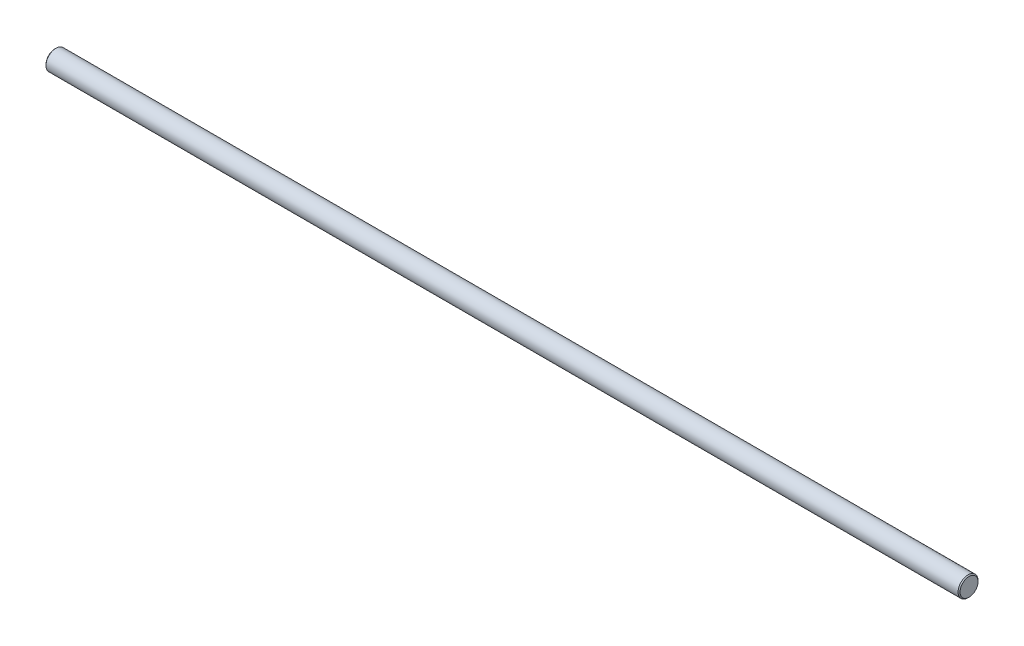
ISO-10303-21;
HEADER;
FILE_DESCRIPTION(('STEP AP214'),'2;1');
FILE_NAME('part.step','',(''),(''),'','','');
FILE_SCHEMA(('AUTOMOTIVE_DESIGN { 1 0 10303 214 1 1 1 1 }'));
ENDSEC;
DATA;
#1=APPLICATION_CONTEXT('core data for automotive mechanical design processes');
#2=APPLICATION_PROTOCOL_DEFINITION('international standard','automotive_design',2000,#1);
#3=PRODUCT_CONTEXT('',#1,'mechanical');
#4=PRODUCT('Part','Part','',(#3));
#5=PRODUCT_RELATED_PRODUCT_CATEGORY('part','',(#4));
#6=PRODUCT_DEFINITION_FORMATION('','',#4);
#7=PRODUCT_DEFINITION_CONTEXT('part definition',#1,'design');
#8=PRODUCT_DEFINITION('design','',#6,#7);
#9=PRODUCT_DEFINITION_SHAPE('','',#8);
#10=(LENGTH_UNIT() NAMED_UNIT(*) SI_UNIT(.MILLI.,.METRE.));
#11=(NAMED_UNIT(*) PLANE_ANGLE_UNIT() SI_UNIT($,.RADIAN.));
#12=(NAMED_UNIT(*) SI_UNIT($,.STERADIAN.) SOLID_ANGLE_UNIT());
#13=UNCERTAINTY_MEASURE_WITH_UNIT(LENGTH_MEASURE(1.E-05),#10,'distance_accuracy_value','');
#14=(GEOMETRIC_REPRESENTATION_CONTEXT(3) GLOBAL_UNCERTAINTY_ASSIGNED_CONTEXT((#13)) GLOBAL_UNIT_ASSIGNED_CONTEXT((#10,
#11,#12)) REPRESENTATION_CONTEXT('',''));
#15=CARTESIAN_POINT('',(0.,0.,0.));
#16=DIRECTION('',(0.,0.,1.));
#17=DIRECTION('',(1.,0.,0.));
#18=AXIS2_PLACEMENT_3D('',#15,#16,#17);
#19=CARTESIAN_POINT('',(0.,0.,0.));
#20=DIRECTION('',(1.,0.,0.));
#21=DIRECTION('',(0.,0.,-1.));
#22=AXIS2_PLACEMENT_3D('',#19,#20,#21);
#23=PLANE('',#22);
#24=CARTESIAN_POINT('',(0.,0.,0.));
#25=DIRECTION('',(-1.,0.,0.));
#26=DIRECTION('',(0.,0.,1.));
#27=AXIS2_PLACEMENT_3D('',#24,#25,#26);
#28=CIRCLE('',#27,4.5);
#29=CARTESIAN_POINT('',(0.,0.,4.5));
#30=VERTEX_POINT('',#29);
#31=EDGE_CURVE('E10',#30,#30,#28,.T.);
#32=ORIENTED_EDGE('',*,*,#31,.T.);
#33=EDGE_LOOP('',(#32));
#34=FACE_BOUND('',#33,.T.);
#35=ADVANCED_FACE('F30',(#34),#23,.F.);
#36=CARTESIAN_POINT('',(0.5,0.,0.));
#37=DIRECTION('',(1.,0.,0.));
#38=DIRECTION('',(0.,0.,-1.));
#39=AXIS2_PLACEMENT_3D('',#36,#37,#38);
#40=CONICAL_SURFACE('',#39,4.99999999999994,0.785398163397392);
#41=ORIENTED_EDGE('',*,*,#31,.F.);
#42=EDGE_LOOP('',(#41));
#43=FACE_BOUND('',#42,.T.);
#44=CARTESIAN_POINT('',(0.5,0.,0.));
#45=DIRECTION('',(-1.,0.,0.));
#46=DIRECTION('',(0.,0.,1.));
#47=AXIS2_PLACEMENT_3D('',#44,#45,#46);
#48=CIRCLE('',#47,4.99999999999994);
#49=CARTESIAN_POINT('',(0.5,0.,4.99999999999994));
#50=VERTEX_POINT('',#49);
#51=EDGE_CURVE('E36',#50,#50,#48,.T.);
#52=ORIENTED_EDGE('',*,*,#51,.T.);
#53=EDGE_LOOP('',(#52));
#54=FACE_BOUND('',#53,.T.);
#55=ADVANCED_FACE('F62',(#43,#54),#40,.T.);
#56=CARTESIAN_POINT('',(458.,0.,0.));
#57=DIRECTION('',(-1.,0.,0.));
#58=DIRECTION('',(0.,0.,1.));
#59=AXIS2_PLACEMENT_3D('',#56,#57,#58);
#60=CYLINDRICAL_SURFACE('',#59,4.99999999999997);
#61=ORIENTED_EDGE('',*,*,#51,.F.);
#62=EDGE_LOOP('',(#61));
#63=FACE_BOUND('',#62,.T.);
#64=CARTESIAN_POINT('',(457.5,0.,0.));
#65=DIRECTION('',(-1.,0.,0.));
#66=DIRECTION('',(0.,0.,1.));
#67=AXIS2_PLACEMENT_3D('',#64,#65,#66);
#68=CIRCLE('',#67,5.);
#69=CARTESIAN_POINT('',(457.5,0.,5.));
#70=VERTEX_POINT('',#69);
#71=EDGE_CURVE('E40',#70,#70,#68,.T.);
#72=ORIENTED_EDGE('',*,*,#71,.T.);
#73=EDGE_LOOP('',(#72));
#74=FACE_BOUND('',#73,.T.);
#75=ADVANCED_FACE('F58',(#63,#74),#60,.T.);
#76=CARTESIAN_POINT('',(458.,0.,0.));
#77=DIRECTION('',(-1.,0.,0.));
#78=DIRECTION('',(0.,0.,1.));
#79=AXIS2_PLACEMENT_3D('',#76,#77,#78);
#80=CONICAL_SURFACE('',#79,4.5,0.785398163397448);
#81=ORIENTED_EDGE('',*,*,#71,.F.);
#82=EDGE_LOOP('',(#81));
#83=FACE_BOUND('',#82,.T.);
#84=CARTESIAN_POINT('',(458.,0.,0.));
#85=DIRECTION('',(-1.,0.,0.));
#86=DIRECTION('',(0.,0.,1.));
#87=AXIS2_PLACEMENT_3D('',#84,#85,#86);
#88=CIRCLE('',#87,4.5);
#89=CARTESIAN_POINT('',(458.,0.,4.5));
#90=VERTEX_POINT('',#89);
#91=EDGE_CURVE('E44',#90,#90,#88,.T.);
#92=ORIENTED_EDGE('',*,*,#91,.T.);
#93=EDGE_LOOP('',(#92));
#94=FACE_BOUND('',#93,.T.);
#95=ADVANCED_FACE('F50',(#83,#94),#80,.T.);
#96=CARTESIAN_POINT('',(458.,4.5,0.));
#97=DIRECTION('',(-1.,0.,0.));
#98=DIRECTION('',(0.,0.,1.));
#99=AXIS2_PLACEMENT_3D('',#96,#97,#98);
#100=PLANE('',#99);
#101=ORIENTED_EDGE('',*,*,#91,.F.);
#102=EDGE_LOOP('',(#101));
#103=FACE_BOUND('',#102,.T.);
#104=ADVANCED_FACE('F52',(#103),#100,.F.);
#105=CLOSED_SHELL('',(#35,#55,#75,#95,#104));
#106=MANIFOLD_SOLID_BREP('B2',#105);
#107=ADVANCED_BREP_SHAPE_REPRESENTATION('',(#18,#106),#14);
#108=SHAPE_DEFINITION_REPRESENTATION(#9,#107);
ENDSEC;
END-ISO-10303-21;
